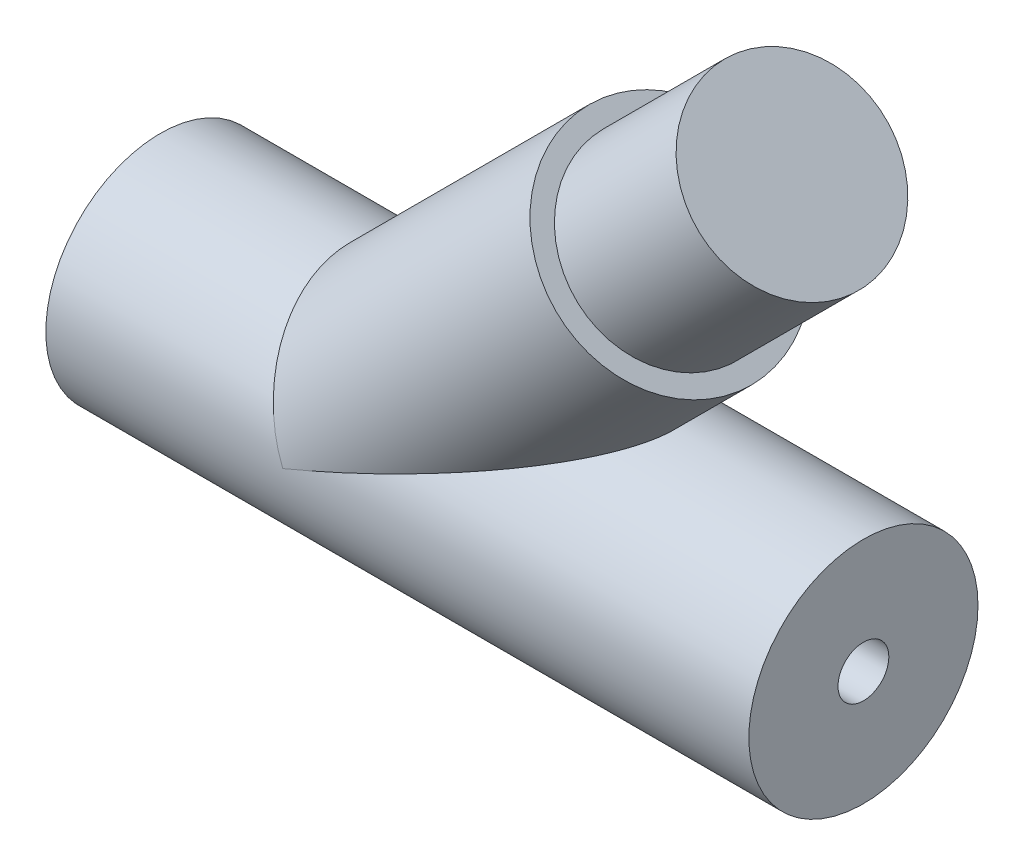
ISO-10303-21;
HEADER;
FILE_DESCRIPTION(('STEP AP214'),'2;1');
FILE_NAME('part.step','',(''),(''),'','','');
FILE_SCHEMA(('AUTOMOTIVE_DESIGN { 1 0 10303 214 1 1 1 1 }'));
ENDSEC;
DATA;
#1=APPLICATION_CONTEXT('core data for automotive mechanical design processes');
#2=APPLICATION_PROTOCOL_DEFINITION('international standard','automotive_design',2000,#1);
#3=PRODUCT_CONTEXT('',#1,'mechanical');
#4=PRODUCT('Part','Part','',(#3));
#5=PRODUCT_RELATED_PRODUCT_CATEGORY('part','',(#4));
#6=PRODUCT_DEFINITION_FORMATION('','',#4);
#7=PRODUCT_DEFINITION_CONTEXT('part definition',#1,'design');
#8=PRODUCT_DEFINITION('design','',#6,#7);
#9=PRODUCT_DEFINITION_SHAPE('','',#8);
#10=(LENGTH_UNIT() NAMED_UNIT(*) SI_UNIT(.MILLI.,.METRE.));
#11=(NAMED_UNIT(*) PLANE_ANGLE_UNIT() SI_UNIT($,.RADIAN.));
#12=(NAMED_UNIT(*) SI_UNIT($,.STERADIAN.) SOLID_ANGLE_UNIT());
#13=UNCERTAINTY_MEASURE_WITH_UNIT(LENGTH_MEASURE(1.E-05),#10,'distance_accuracy_value','');
#14=(GEOMETRIC_REPRESENTATION_CONTEXT(3) GLOBAL_UNCERTAINTY_ASSIGNED_CONTEXT((#13)) GLOBAL_UNIT_ASSIGNED_CONTEXT((#10,
#11,#12)) REPRESENTATION_CONTEXT('',''));
#15=CARTESIAN_POINT('',(0.,0.,0.));
#16=DIRECTION('',(0.,0.,1.));
#17=DIRECTION('',(1.,0.,0.));
#18=AXIS2_PLACEMENT_3D('',#15,#16,#17);
#19=CARTESIAN_POINT('',(111.363258413372,45.3384507329566,-7.4118316495124E-05));
#20=DIRECTION('',(0.707106781186549,0.707106781186546,0.));
#21=DIRECTION('',(-0.707106781186546,0.707106781186549,0.));
#22=AXIS2_PLACEMENT_3D('',#19,#20,#21);
#23=PLANE('',#22);
#24=CARTESIAN_POINT('',(111.363258413372,45.3384507329566,-7.4118316495124E-05));
#25=DIRECTION('',(0.707106781186549,0.707106781186546,0.));
#26=DIRECTION('',(-0.707106781186546,0.707106781186549,0.));
#27=AXIS2_PLACEMENT_3D('',#24,#25,#26);
#28=CIRCLE('',#27,16.9164);
#29=CARTESIAN_POINT('',(99.4015572601079,57.3001518862207,-7.4118316495124E-05));
#30=VERTEX_POINT('',#29);
#31=EDGE_CURVE('E59',#30,#30,#28,.T.);
#32=ORIENTED_EDGE('',*,*,#31,.T.);
#33=EDGE_LOOP('',(#32));
#34=FACE_BOUND('',#33,.T.);
#35=CARTESIAN_POINT('',(111.363258413372,45.3384507329566,-7.4118316495124E-05));
#36=DIRECTION('',(0.707106781186549,0.707106781186546,0.));
#37=DIRECTION('',(-0.707106781186546,0.707106781186549,0.));
#38=AXIS2_PLACEMENT_3D('',#35,#36,#37);
#39=CIRCLE('',#38,13.97);
#40=CARTESIAN_POINT('',(101.484976680196,55.2167324661327,-7.4118316495124E-05));
#41=VERTEX_POINT('',#40);
#42=EDGE_CURVE('E70',#41,#41,#39,.T.);
#43=ORIENTED_EDGE('',*,*,#42,.F.);
#44=EDGE_LOOP('',(#43));
#45=FACE_BOUND('',#44,.T.);
#46=ADVANCED_FACE('F37',(#34,#45),#23,.T.);
#47=CARTESIAN_POINT('',(139.878171885739,5.03336420532345,-7.4118316495124E-05));
#48=DIRECTION('',(-1.,0.,0.));
#49=DIRECTION('',(0.,0.,1.));
#50=AXIS2_PLACEMENT_3D('',#47,#48,#49);
#51=CYLINDRICAL_SURFACE('',#50,16.9164);
#52=CARTESIAN_POINT('',(36.0781718857388,5.03336420532345,-7.4118316495124E-05));
#53=DIRECTION('',(1.,0.,0.));
#54=DIRECTION('',(0.,0.,-1.));
#55=AXIS2_PLACEMENT_3D('',#52,#53,#54);
#56=CIRCLE('',#55,16.9164);
#57=CARTESIAN_POINT('',(36.0781718857388,5.03336420532345,-16.9164741183165));
#58=VERTEX_POINT('',#57);
#59=EDGE_CURVE('E55',#58,#58,#56,.T.);
#60=ORIENTED_EDGE('',*,*,#59,.T.);
#61=EDGE_LOOP('',(#60));
#62=FACE_BOUND('',#61,.T.);
#63=CARTESIAN_POINT('',(139.878171885739,5.03336420532345,-7.4118316495124E-05));
#64=DIRECTION('',(1.,0.,0.));
#65=DIRECTION('',(0.,0.,-1.));
#66=AXIS2_PLACEMENT_3D('',#63,#64,#65);
#67=CIRCLE('',#66,16.9164);
#68=CARTESIAN_POINT('',(139.878171885739,5.03336420532345,-16.9164741183165));
#69=VERTEX_POINT('',#68);
#70=EDGE_CURVE('E53',#69,#69,#67,.T.);
#71=ORIENTED_EDGE('',*,*,#70,.F.);
#72=EDGE_LOOP('',(#71));
#73=FACE_BOUND('',#72,.T.);
#74=CARTESIAN_POINT('',(71.0581718857388,5.03336420532345,-7.4118316495124E-05));
#75=DIRECTION('',(-0.923879532511287,-0.382683432365089,0.));
#76=DIRECTION('',(-0.382683432365089,0.923879532511287,0.));
#77=AXIS2_PLACEMENT_3D('',#74,#75,#76);
#78=ELLIPSE('',#77,18.3101794170262,16.9164);
#79=CARTESIAN_POINT('',(71.0581718857388,5.03336420532345,-16.9164741183165));
#80=VERTEX_POINT('',#79);
#81=CARTESIAN_POINT('',(71.0581718857388,5.03336420532345,16.9163258816835));
#82=VERTEX_POINT('',#81);
#83=EDGE_CURVE('E11',#80,#82,#78,.F.);
#84=ORIENTED_EDGE('',*,*,#83,.F.);
#85=CARTESIAN_POINT('',(71.0581718857388,5.03336420532345,-7.4118316495124E-05));
#86=DIRECTION('',(-0.382683432365089,0.923879532511287,0.));
#87=DIRECTION('',(-0.923879532511287,-0.382683432365089,0.));
#88=AXIS2_PLACEMENT_3D('',#85,#86,#87);
#89=ELLIPSE('',#88,44.2046834780696,16.9164);
#90=EDGE_CURVE('E45',#82,#80,#89,.T.);
#91=ORIENTED_EDGE('',*,*,#90,.F.);
#92=EDGE_LOOP('',(#84,#91));
#93=FACE_BOUND('',#92,.T.);
#94=ADVANCED_FACE('F39',(#62,#73,#93),#51,.T.);
#95=CARTESIAN_POINT('',(139.878171885739,5.03336420532345,-7.4118316495124E-05));
#96=DIRECTION('',(1.,0.,0.));
#97=DIRECTION('',(0.,0.,-1.));
#98=AXIS2_PLACEMENT_3D('',#95,#96,#97);
#99=PLANE('',#98);
#100=CARTESIAN_POINT('',(139.878171885739,5.03336420532345,-7.4118316495124E-05));
#101=DIRECTION('',(1.,0.,0.));
#102=DIRECTION('',(0.,0.,-1.));
#103=AXIS2_PLACEMENT_3D('',#100,#101,#102);
#104=CIRCLE('',#103,3.75);
#105=CARTESIAN_POINT('',(139.878171885739,5.03336420532345,-3.75007411831649));
#106=VERTEX_POINT('',#105);
#107=EDGE_CURVE('E63',#106,#106,#104,.T.);
#108=ORIENTED_EDGE('',*,*,#107,.F.);
#109=EDGE_LOOP('',(#108));
#110=FACE_BOUND('',#109,.T.);
#111=ORIENTED_EDGE('',*,*,#70,.T.);
#112=EDGE_LOOP('',(#111));
#113=FACE_BOUND('',#112,.T.);
#114=ADVANCED_FACE('F91',(#110,#113),#99,.T.);
#115=CARTESIAN_POINT('',(36.0781718857388,5.03336420532345,-7.4118316495124E-05));
#116=DIRECTION('',(1.,0.,0.));
#117=DIRECTION('',(0.,0.,-1.));
#118=AXIS2_PLACEMENT_3D('',#115,#116,#117);
#119=PLANE('',#118);
#120=CARTESIAN_POINT('',(36.0781718857388,5.03336420532345,-7.4118316495124E-05));
#121=DIRECTION('',(-1.,0.,0.));
#122=DIRECTION('',(0.,0.,1.));
#123=AXIS2_PLACEMENT_3D('',#120,#121,#122);
#124=CIRCLE('',#123,3.75);
#125=CARTESIAN_POINT('',(36.0781718857388,5.03336420532345,3.7499258816835));
#126=VERTEX_POINT('',#125);
#127=EDGE_CURVE('E66',#126,#126,#124,.T.);
#128=ORIENTED_EDGE('',*,*,#127,.F.);
#129=EDGE_LOOP('',(#128));
#130=FACE_BOUND('',#129,.T.);
#131=ORIENTED_EDGE('',*,*,#59,.F.);
#132=EDGE_LOOP('',(#131));
#133=FACE_BOUND('',#132,.T.);
#134=ADVANCED_FACE('F97',(#130,#133),#119,.F.);
#135=CARTESIAN_POINT('',(111.363258413372,45.3384507329566,-7.4118316495124E-05));
#136=DIRECTION('',(-0.707106781186549,-0.707106781186546,0.));
#137=DIRECTION('',(0.707106781186546,-0.707106781186549,0.));
#138=AXIS2_PLACEMENT_3D('',#135,#136,#137);
#139=CYLINDRICAL_SURFACE('',#138,16.9164);
#140=ORIENTED_EDGE('',*,*,#31,.F.);
#141=EDGE_LOOP('',(#140));
#142=FACE_BOUND('',#141,.T.);
#143=ORIENTED_EDGE('',*,*,#90,.T.);
#144=ORIENTED_EDGE('',*,*,#83,.T.);
#145=EDGE_LOOP('',(#143,#144));
#146=FACE_BOUND('',#145,.T.);
#147=ADVANCED_FACE('F52',(#142,#146),#139,.T.);
#148=CARTESIAN_POINT('',(257.718171885739,5.03336420532345,-7.4118316495124E-05));
#149=DIRECTION('',(-1.,0.,0.));
#150=DIRECTION('',(0.,0.,1.));
#151=AXIS2_PLACEMENT_3D('',#148,#149,#150);
#152=CYLINDRICAL_SURFACE('',#151,3.75);
#153=ORIENTED_EDGE('',*,*,#107,.T.);
#154=EDGE_LOOP('',(#153));
#155=FACE_BOUND('',#154,.T.);
#156=ORIENTED_EDGE('',*,*,#127,.T.);
#157=EDGE_LOOP('',(#156));
#158=FACE_BOUND('',#157,.T.);
#159=ADVANCED_FACE('F81',(#155,#158),#152,.F.);
#160=CARTESIAN_POINT('',(129.32377065551,63.2989629750949,-7.4118316495124E-05));
#161=DIRECTION('',(-0.707106781186549,-0.707106781186546,0.));
#162=DIRECTION('',(0.707106781186546,-0.707106781186549,0.));
#163=AXIS2_PLACEMENT_3D('',#160,#161,#162);
#164=CYLINDRICAL_SURFACE('',#163,13.97);
#165=CARTESIAN_POINT('',(129.32377065551,63.2989629750949,-7.4118316495124E-05));
#166=DIRECTION('',(0.707106781186549,0.707106781186546,0.));
#167=DIRECTION('',(-0.707106781186546,0.707106781186549,0.));
#168=AXIS2_PLACEMENT_3D('',#165,#166,#167);
#169=CIRCLE('',#168,13.97);
#170=CARTESIAN_POINT('',(119.445488922334,73.1772447082709,-7.4118316495124E-05));
#171=VERTEX_POINT('',#170);
#172=EDGE_CURVE('E69',#171,#171,#169,.T.);
#173=ORIENTED_EDGE('',*,*,#172,.F.);
#174=EDGE_LOOP('',(#173));
#175=FACE_BOUND('',#174,.T.);
#176=ORIENTED_EDGE('',*,*,#42,.T.);
#177=EDGE_LOOP('',(#176));
#178=FACE_BOUND('',#177,.T.);
#179=ADVANCED_FACE('F78',(#175,#178),#164,.T.);
#180=CARTESIAN_POINT('',(129.32377065551,63.2989629750949,-7.4118316495124E-05));
#181=DIRECTION('',(0.707106781186549,0.707106781186546,0.));
#182=DIRECTION('',(-0.707106781186546,0.707106781186549,0.));
#183=AXIS2_PLACEMENT_3D('',#180,#181,#182);
#184=PLANE('',#183);
#185=ORIENTED_EDGE('',*,*,#172,.T.);
#186=EDGE_LOOP('',(#185));
#187=FACE_BOUND('',#186,.T.);
#188=ADVANCED_FACE('F76',(#187),#184,.T.);
#189=CLOSED_SHELL('',(#46,#94,#114,#134,#147,#159,#179,#188));
#190=MANIFOLD_SOLID_BREP('B2',#189);
#191=ADVANCED_BREP_SHAPE_REPRESENTATION('',(#18,#190),#14);
#192=SHAPE_DEFINITION_REPRESENTATION(#9,#191);
ENDSEC;
END-ISO-10303-21;
